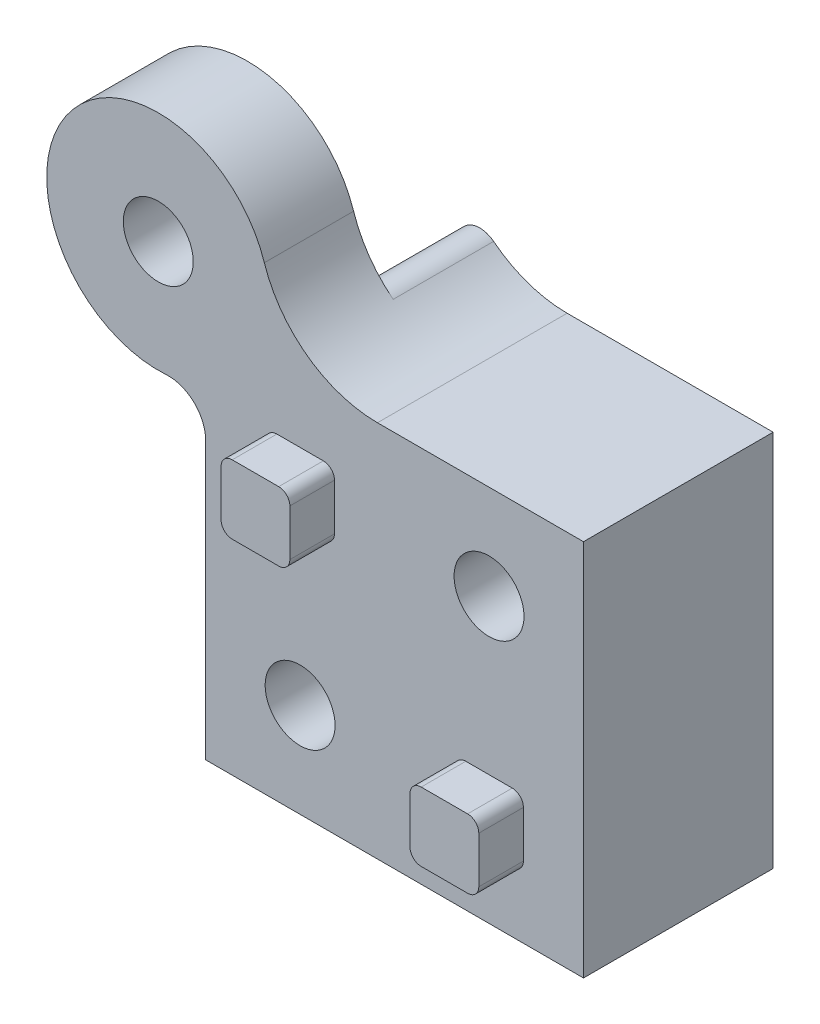
ISO-10303-21;
HEADER;
FILE_DESCRIPTION(('STEP AP214'),'2;1');
FILE_NAME('part.step','',(''),(''),'','','');
FILE_SCHEMA(('AUTOMOTIVE_DESIGN { 1 0 10303 214 1 1 1 1 }'));
ENDSEC;
DATA;
#1=APPLICATION_CONTEXT('core data for automotive mechanical design processes');
#2=APPLICATION_PROTOCOL_DEFINITION('international standard','automotive_design',2000,#1);
#3=PRODUCT_CONTEXT('',#1,'mechanical');
#4=PRODUCT('Part','Part','',(#3));
#5=PRODUCT_RELATED_PRODUCT_CATEGORY('part','',(#4));
#6=PRODUCT_DEFINITION_FORMATION('','',#4);
#7=PRODUCT_DEFINITION_CONTEXT('part definition',#1,'design');
#8=PRODUCT_DEFINITION('design','',#6,#7);
#9=PRODUCT_DEFINITION_SHAPE('','',#8);
#10=(LENGTH_UNIT() NAMED_UNIT(*) SI_UNIT(.MILLI.,.METRE.));
#11=(NAMED_UNIT(*) PLANE_ANGLE_UNIT() SI_UNIT($,.RADIAN.));
#12=(NAMED_UNIT(*) SI_UNIT($,.STERADIAN.) SOLID_ANGLE_UNIT());
#13=UNCERTAINTY_MEASURE_WITH_UNIT(LENGTH_MEASURE(1.E-05),#10,'distance_accuracy_value','');
#14=(GEOMETRIC_REPRESENTATION_CONTEXT(3) GLOBAL_UNCERTAINTY_ASSIGNED_CONTEXT((#13)) GLOBAL_UNIT_ASSIGNED_CONTEXT((#10,
#11,#12)) REPRESENTATION_CONTEXT('',''));
#15=CARTESIAN_POINT('',(0.,0.,0.));
#16=DIRECTION('',(0.,0.,1.));
#17=DIRECTION('',(1.,0.,0.));
#18=AXIS2_PLACEMENT_3D('',#15,#16,#17);
#19=CARTESIAN_POINT('',(0.,0.,-6.));
#20=DIRECTION('',(0.,0.,-1.));
#21=DIRECTION('',(-1.,0.,0.));
#22=AXIS2_PLACEMENT_3D('',#19,#20,#21);
#23=PLANE('',#22);
#24=CARTESIAN_POINT('',(66.6819805153394,193.68198051534,-6.));
#25=DIRECTION('',(0.,0.,-1.));
#26=DIRECTION('',(-1.,0.,0.));
#27=AXIS2_PLACEMENT_3D('',#24,#25,#26);
#28=CIRCLE('',#27,2.34999999999999);
#29=CARTESIAN_POINT('',(64.3319805153394,193.68198051534,-6.));
#30=VERTEX_POINT('',#29);
#31=EDGE_CURVE('E275',#30,#30,#28,.T.);
#32=ORIENTED_EDGE('',*,*,#31,.F.);
#33=EDGE_LOOP('',(#32));
#34=FACE_BOUND('',#33,.T.);
#35=CARTESIAN_POINT('',(66.6819805153394,193.68198051534,-6.));
#36=DIRECTION('',(0.,0.,1.));
#37=DIRECTION('',(1.,0.,0.));
#38=AXIS2_PLACEMENT_3D('',#35,#36,#37);
#39=CIRCLE('',#38,7.75);
#40=CARTESIAN_POINT('',(68.1617269345518,186.074559760916,-6.));
#41=VERTEX_POINT('',#40);
#42=CARTESIAN_POINT('',(74.1068195322732,191.460659833264,-6.));
#43=VERTEX_POINT('',#42);
#44=EDGE_CURVE('E245',#41,#43,#39,.T.);
#45=ORIENTED_EDGE('',*,*,#44,.F.);
#46=CARTESIAN_POINT('',(67.3639610306788,183.70526248902,-6.));
#47=DIRECTION('',(0.,0.,-1.));
#48=DIRECTION('',(-1.,0.,0.));
#49=AXIS2_PLACEMENT_3D('',#46,#47,#48);
#50=CIRCLE('',#49,2.5);
#51=CARTESIAN_POINT('',(67.193465901844,186.1994419956,-6.));
#52=VERTEX_POINT('',#51);
#53=EDGE_CURVE('E340',#41,#52,#50,.F.);
#54=ORIENTED_EDGE('',*,*,#53,.T.);
#55=CARTESIAN_POINT('',(66.6819805153394,193.68198051534,-6.));
#56=DIRECTION('',(0.,0.,-1.));
#57=DIRECTION('',(-1.,0.,0.));
#58=AXIS2_PLACEMENT_3D('',#55,#56,#57);
#59=CIRCLE('',#58,7.50000000000001);
#60=CARTESIAN_POINT('',(73.8104474944771,196.013280265982,-6.));
#61=VERTEX_POINT('',#60);
#62=EDGE_CURVE('E273',#52,#61,#59,.T.);
#63=ORIENTED_EDGE('',*,*,#62,.T.);
#64=CARTESIAN_POINT('',(81.4141456055572,198.5,-6.));
#65=DIRECTION('',(0.,0.,-1.));
#66=DIRECTION('',(-1.,0.,0.));
#67=AXIS2_PLACEMENT_3D('',#64,#65,#66);
#68=CIRCLE('',#67,8.);
#69=CARTESIAN_POINT('',(76.4707683785229,192.210085724651,-6.));
#70=VERTEX_POINT('',#69);
#71=EDGE_CURVE('E324',#61,#70,#68,.F.);
#72=ORIENTED_EDGE('',*,*,#71,.T.);
#73=CARTESIAN_POINT('',(75.5438851484539,191.030726798023,-6.));
#74=DIRECTION('',(0.,0.,-1.));
#75=DIRECTION('',(-1.,0.,0.));
#76=AXIS2_PLACEMENT_3D('',#73,#74,#75);
#77=CIRCLE('',#76,1.5);
#78=EDGE_CURVE('E350',#70,#43,#77,.F.);
#79=ORIENTED_EDGE('',*,*,#78,.T.);
#80=EDGE_LOOP('',(#45,#54,#63,#72,#79));
#81=FACE_BOUND('',#80,.T.);
#82=ADVANCED_FACE('F37',(#34,#81),#23,.T.);
#83=CARTESIAN_POINT('',(0.,0.,0.));
#84=DIRECTION('',(0.,0.,-1.));
#85=DIRECTION('',(-1.,0.,0.));
#86=AXIS2_PLACEMENT_3D('',#83,#84,#85);
#87=PLANE('',#86);
#88=CARTESIAN_POINT('',(88.9139610306788,184.15,0.));
#89=DIRECTION('',(0.,0.,-1.));
#90=DIRECTION('',(-1.,0.,0.));
#91=AXIS2_PLACEMENT_3D('',#88,#89,#90);
#92=CIRCLE('',#91,2.35);
#93=CARTESIAN_POINT('',(86.5639610306788,184.15,0.));
#94=VERTEX_POINT('',#93);
#95=EDGE_CURVE('E248',#94,#94,#92,.T.);
#96=ORIENTED_EDGE('',*,*,#95,.T.);
#97=EDGE_LOOP('',(#96));
#98=FACE_BOUND('',#97,.T.);
#99=CARTESIAN_POINT('',(76.2139610306788,171.45,0.));
#100=DIRECTION('',(0.,0.,-1.));
#101=DIRECTION('',(-1.,0.,0.));
#102=AXIS2_PLACEMENT_3D('',#99,#100,#101);
#103=CIRCLE('',#102,2.35);
#104=CARTESIAN_POINT('',(73.8639610306788,171.45,0.));
#105=VERTEX_POINT('',#104);
#106=EDGE_CURVE('E799',#105,#105,#103,.T.);
#107=ORIENTED_EDGE('',*,*,#106,.T.);
#108=EDGE_LOOP('',(#107));
#109=FACE_BOUND('',#108,.T.);
#110=CARTESIAN_POINT('',(66.6819805153394,193.68198051534,0.));
#111=DIRECTION('',(0.,0.,-1.));
#112=DIRECTION('',(-1.,0.,0.));
#113=AXIS2_PLACEMENT_3D('',#110,#111,#112);
#114=CIRCLE('',#113,2.34999999999999);
#115=CARTESIAN_POINT('',(64.3319805153394,193.68198051534,0.));
#116=VERTEX_POINT('',#115);
#117=EDGE_CURVE('E276',#116,#116,#114,.T.);
#118=ORIENTED_EDGE('',*,*,#117,.T.);
#119=EDGE_LOOP('',(#118));
#120=FACE_BOUND('',#119,.T.);
#121=CARTESIAN_POINT('',(66.6819805153394,193.68198051534,0.));
#122=DIRECTION('',(0.,0.,-1.));
#123=DIRECTION('',(-1.,0.,0.));
#124=AXIS2_PLACEMENT_3D('',#121,#122,#123);
#125=CIRCLE('',#124,7.50000000000001);
#126=CARTESIAN_POINT('',(67.193465901844,186.1994419956,0.));
#127=VERTEX_POINT('',#126);
#128=CARTESIAN_POINT('',(73.8104474944771,196.013280265982,0.));
#129=VERTEX_POINT('',#128);
#130=EDGE_CURVE('E262',#127,#129,#125,.T.);
#131=ORIENTED_EDGE('',*,*,#130,.F.);
#132=CARTESIAN_POINT('',(67.3639610306788,183.70526248902,0.));
#133=DIRECTION('',(0.,0.,-1.));
#134=DIRECTION('',(-1.,0.,0.));
#135=AXIS2_PLACEMENT_3D('',#132,#133,#134);
#136=CIRCLE('',#135,2.5);
#137=CARTESIAN_POINT('',(69.8639610306788,183.70526248902,0.));
#138=VERTEX_POINT('',#137);
#139=EDGE_CURVE('E332',#127,#138,#136,.T.);
#140=ORIENTED_EDGE('',*,*,#139,.T.);
#141=DIRECTION('',(0.,-1.,0.));
#142=VECTOR('',#141,1.);
#143=CARTESIAN_POINT('',(69.8639610306788,0.,0.));
#144=LINE('',#143,#142);
#145=CARTESIAN_POINT('',(69.8639610306788,165.1,0.));
#146=VERTEX_POINT('',#145);
#147=EDGE_CURVE('E287',#138,#146,#144,.T.);
#148=ORIENTED_EDGE('',*,*,#147,.T.);
#149=DIRECTION('',(1.,0.,0.));
#150=VECTOR('',#149,1.);
#151=CARTESIAN_POINT('',(0.,165.1,0.));
#152=LINE('',#151,#150);
#153=CARTESIAN_POINT('',(95.2639610306788,165.1,0.));
#154=VERTEX_POINT('',#153);
#155=EDGE_CURVE('E284',#146,#154,#152,.T.);
#156=ORIENTED_EDGE('',*,*,#155,.T.);
#157=DIRECTION('',(0.,1.,0.));
#158=VECTOR('',#157,1.);
#159=CARTESIAN_POINT('',(95.2639610306788,0.,0.));
#160=LINE('',#159,#158);
#161=CARTESIAN_POINT('',(95.2639610306788,190.5,0.));
#162=VERTEX_POINT('',#161);
#163=EDGE_CURVE('E282',#154,#162,#160,.T.);
#164=ORIENTED_EDGE('',*,*,#163,.T.);
#165=DIRECTION('',(-1.,0.,0.));
#166=VECTOR('',#165,1.);
#167=CARTESIAN_POINT('',(0.,190.5,0.));
#168=LINE('',#167,#166);
#169=CARTESIAN_POINT('',(81.4141456055572,190.5,0.));
#170=VERTEX_POINT('',#169);
#171=EDGE_CURVE('E228',#162,#170,#168,.T.);
#172=ORIENTED_EDGE('',*,*,#171,.T.);
#173=CARTESIAN_POINT('',(81.4141456055572,198.5,0.));
#174=DIRECTION('',(0.,0.,-1.));
#175=DIRECTION('',(-1.,0.,0.));
#176=AXIS2_PLACEMENT_3D('',#173,#174,#175);
#177=CIRCLE('',#176,8.);
#178=EDGE_CURVE('E321',#170,#129,#177,.T.);
#179=ORIENTED_EDGE('',*,*,#178,.T.);
#180=EDGE_LOOP('',(#131,#140,#148,#156,#164,#172,#179));
#181=FACE_BOUND('',#180,.T.);
#182=DIRECTION('',(0.,1.,0.));
#183=VECTOR('',#182,1.);
#184=CARTESIAN_POINT('',(78.5253610306788,181.8386,0.));
#185=LINE('',#184,#183);
#186=CARTESIAN_POINT('',(78.5253610306788,182.5886,0.));
#187=VERTEX_POINT('',#186);
#188=CARTESIAN_POINT('',(78.5253610306788,185.7114,0.));
#189=VERTEX_POINT('',#188);
#190=EDGE_CURVE('E232',#187,#189,#185,.T.);
#191=ORIENTED_EDGE('',*,*,#190,.F.);
#192=CARTESIAN_POINT('',(77.7753610306788,182.5886,0.));
#193=DIRECTION('',(0.,0.,-1.));
#194=DIRECTION('',(-1.,0.,0.));
#195=AXIS2_PLACEMENT_3D('',#192,#193,#194);
#196=CIRCLE('',#195,0.75);
#197=CARTESIAN_POINT('',(77.7753610306788,181.8386,0.));
#198=VERTEX_POINT('',#197);
#199=EDGE_CURVE('E415',#187,#198,#196,.T.);
#200=ORIENTED_EDGE('',*,*,#199,.T.);
#201=DIRECTION('',(1.,0.,0.));
#202=VECTOR('',#201,1.);
#203=CARTESIAN_POINT('',(73.9025610306788,181.8386,0.));
#204=LINE('',#203,#202);
#205=CARTESIAN_POINT('',(74.6525610306788,181.8386,0.));
#206=VERTEX_POINT('',#205);
#207=EDGE_CURVE('E298',#206,#198,#204,.T.);
#208=ORIENTED_EDGE('',*,*,#207,.F.);
#209=CARTESIAN_POINT('',(74.6525610306788,182.5886,0.));
#210=DIRECTION('',(0.,0.,-1.));
#211=DIRECTION('',(-1.,0.,0.));
#212=AXIS2_PLACEMENT_3D('',#209,#210,#211);
#213=CIRCLE('',#212,0.75);
#214=CARTESIAN_POINT('',(73.9025610306788,182.5886,0.));
#215=VERTEX_POINT('',#214);
#216=EDGE_CURVE('E417',#206,#215,#213,.T.);
#217=ORIENTED_EDGE('',*,*,#216,.T.);
#218=DIRECTION('',(0.,-1.,0.));
#219=VECTOR('',#218,1.);
#220=CARTESIAN_POINT('',(73.9025610306788,186.4614,0.));
#221=LINE('',#220,#219);
#222=CARTESIAN_POINT('',(73.9025610306788,185.7114,0.));
#223=VERTEX_POINT('',#222);
#224=EDGE_CURVE('E312',#223,#215,#221,.T.);
#225=ORIENTED_EDGE('',*,*,#224,.F.);
#226=CARTESIAN_POINT('',(74.6525610306788,185.7114,0.));
#227=DIRECTION('',(0.,0.,-1.));
#228=DIRECTION('',(-1.,0.,0.));
#229=AXIS2_PLACEMENT_3D('',#226,#227,#228);
#230=CIRCLE('',#229,0.75);
#231=CARTESIAN_POINT('',(74.6525610306788,186.4614,0.));
#232=VERTEX_POINT('',#231);
#233=EDGE_CURVE('E11',#223,#232,#230,.T.);
#234=ORIENTED_EDGE('',*,*,#233,.T.);
#235=DIRECTION('',(-1.,0.,0.));
#236=VECTOR('',#235,1.);
#237=CARTESIAN_POINT('',(78.5253610306788,186.4614,0.));
#238=LINE('',#237,#236);
#239=CARTESIAN_POINT('',(77.7753610306788,186.4614,0.));
#240=VERTEX_POINT('',#239);
#241=EDGE_CURVE('E310',#240,#232,#238,.T.);
#242=ORIENTED_EDGE('',*,*,#241,.F.);
#243=CARTESIAN_POINT('',(77.7753610306788,185.7114,0.));
#244=DIRECTION('',(0.,0.,-1.));
#245=DIRECTION('',(-1.,0.,0.));
#246=AXIS2_PLACEMENT_3D('',#243,#244,#245);
#247=CIRCLE('',#246,0.75);
#248=EDGE_CURVE('E45',#240,#189,#247,.T.);
#249=ORIENTED_EDGE('',*,*,#248,.T.);
#250=EDGE_LOOP('',(#191,#200,#208,#217,#225,#234,#242,#249));
#251=FACE_BOUND('',#250,.T.);
#252=DIRECTION('',(-1.,0.,0.));
#253=VECTOR('',#252,1.);
#254=CARTESIAN_POINT('',(91.2253610306788,173.7614,0.));
#255=LINE('',#254,#253);
#256=CARTESIAN_POINT('',(90.4753610306788,173.7614,0.));
#257=VERTEX_POINT('',#256);
#258=CARTESIAN_POINT('',(87.3525610306788,173.7614,0.));
#259=VERTEX_POINT('',#258);
#260=EDGE_CURVE('E244',#257,#259,#255,.T.);
#261=ORIENTED_EDGE('',*,*,#260,.F.);
#262=CARTESIAN_POINT('',(90.4753610306788,173.0114,0.));
#263=DIRECTION('',(0.,0.,-1.));
#264=DIRECTION('',(-1.,0.,0.));
#265=AXIS2_PLACEMENT_3D('',#262,#263,#264);
#266=CIRCLE('',#265,0.75);
#267=CARTESIAN_POINT('',(91.2253610306788,173.0114,0.));
#268=VERTEX_POINT('',#267);
#269=EDGE_CURVE('E411',#257,#268,#266,.T.);
#270=ORIENTED_EDGE('',*,*,#269,.T.);
#271=DIRECTION('',(0.,1.,0.));
#272=VECTOR('',#271,1.);
#273=CARTESIAN_POINT('',(91.2253610306788,169.1386,0.));
#274=LINE('',#273,#272);
#275=CARTESIAN_POINT('',(91.2253610306788,169.8886,0.));
#276=VERTEX_POINT('',#275);
#277=EDGE_CURVE('E253',#276,#268,#274,.T.);
#278=ORIENTED_EDGE('',*,*,#277,.F.);
#279=CARTESIAN_POINT('',(90.4753610306788,169.8886,0.));
#280=DIRECTION('',(0.,0.,-1.));
#281=DIRECTION('',(-1.,0.,0.));
#282=AXIS2_PLACEMENT_3D('',#279,#280,#281);
#283=CIRCLE('',#282,0.75);
#284=CARTESIAN_POINT('',(90.4753610306788,169.1386,0.));
#285=VERTEX_POINT('',#284);
#286=EDGE_CURVE('E409',#276,#285,#283,.T.);
#287=ORIENTED_EDGE('',*,*,#286,.T.);
#288=DIRECTION('',(1.,0.,0.));
#289=VECTOR('',#288,1.);
#290=CARTESIAN_POINT('',(86.6025610306788,169.1386,0.));
#291=LINE('',#290,#289);
#292=CARTESIAN_POINT('',(87.3525610306788,169.1386,0.));
#293=VERTEX_POINT('',#292);
#294=EDGE_CURVE('E268',#293,#285,#291,.T.);
#295=ORIENTED_EDGE('',*,*,#294,.F.);
#296=CARTESIAN_POINT('',(87.3525610306788,169.8886,0.));
#297=DIRECTION('',(0.,0.,-1.));
#298=DIRECTION('',(-1.,0.,0.));
#299=AXIS2_PLACEMENT_3D('',#296,#297,#298);
#300=CIRCLE('',#299,0.75);
#301=CARTESIAN_POINT('',(86.6025610306788,169.8886,0.));
#302=VERTEX_POINT('',#301);
#303=EDGE_CURVE('E407',#293,#302,#300,.T.);
#304=ORIENTED_EDGE('',*,*,#303,.T.);
#305=DIRECTION('',(0.,-1.,0.));
#306=VECTOR('',#305,1.);
#307=CARTESIAN_POINT('',(86.6025610306788,173.7614,0.));
#308=LINE('',#307,#306);
#309=CARTESIAN_POINT('',(86.6025610306788,173.0114,0.));
#310=VERTEX_POINT('',#309);
#311=EDGE_CURVE('E265',#310,#302,#308,.T.);
#312=ORIENTED_EDGE('',*,*,#311,.F.);
#313=CARTESIAN_POINT('',(87.3525610306788,173.0114,0.));
#314=DIRECTION('',(0.,0.,-1.));
#315=DIRECTION('',(-1.,0.,0.));
#316=AXIS2_PLACEMENT_3D('',#313,#314,#315);
#317=CIRCLE('',#316,0.75);
#318=EDGE_CURVE('E413',#310,#259,#317,.T.);
#319=ORIENTED_EDGE('',*,*,#318,.T.);
#320=EDGE_LOOP('',(#261,#270,#278,#287,#295,#304,#312,#319));
#321=FACE_BOUND('',#320,.T.);
#322=ADVANCED_FACE('F419',(#98,#109,#120,#181,#251,#321),#87,.F.);
#323=CARTESIAN_POINT('',(78.5253610306788,181.8386,3.));
#324=DIRECTION('',(-1.,0.,0.));
#325=DIRECTION('',(0.,0.,1.));
#326=AXIS2_PLACEMENT_3D('',#323,#324,#325);
#327=PLANE('',#326);
#328=DIRECTION('',(0.,1.,0.));
#329=VECTOR('',#328,1.);
#330=CARTESIAN_POINT('',(78.5253610306788,181.8386,3.));
#331=LINE('',#330,#329);
#332=CARTESIAN_POINT('',(78.5253610306788,182.5886,3.));
#333=VERTEX_POINT('',#332);
#334=CARTESIAN_POINT('',(78.5253610306788,185.7114,3.));
#335=VERTEX_POINT('',#334);
#336=EDGE_CURVE('E294',#333,#335,#331,.T.);
#337=ORIENTED_EDGE('',*,*,#336,.F.);
#338=DIRECTION('',(0.,0.,-1.));
#339=VECTOR('',#338,1.);
#340=CARTESIAN_POINT('',(78.5253610306788,182.5886,3.));
#341=LINE('',#340,#339);
#342=EDGE_CURVE('E382',#333,#187,#341,.T.);
#343=ORIENTED_EDGE('',*,*,#342,.T.);
#344=ORIENTED_EDGE('',*,*,#190,.T.);
#345=DIRECTION('',(0.,0.,-1.));
#346=VECTOR('',#345,1.);
#347=CARTESIAN_POINT('',(78.5253610306788,185.7114,3.));
#348=LINE('',#347,#346);
#349=EDGE_CURVE('E380',#189,#335,#348,.F.);
#350=ORIENTED_EDGE('',*,*,#349,.T.);
#351=EDGE_LOOP('',(#337,#343,#344,#350));
#352=FACE_BOUND('',#351,.T.);
#353=ADVANCED_FACE('F423',(#352),#327,.F.);
#354=CARTESIAN_POINT('',(78.5253610306788,186.4614,3.));
#355=DIRECTION('',(0.,-1.,0.));
#356=DIRECTION('',(0.,0.,-1.));
#357=AXIS2_PLACEMENT_3D('',#354,#355,#356);
#358=PLANE('',#357);
#359=DIRECTION('',(-1.,0.,0.));
#360=VECTOR('',#359,1.);
#361=CARTESIAN_POINT('',(78.5253610306788,186.4614,3.));
#362=LINE('',#361,#360);
#363=CARTESIAN_POINT('',(77.7753610306788,186.4614,3.));
#364=VERTEX_POINT('',#363);
#365=CARTESIAN_POINT('',(74.6525610306788,186.4614,3.));
#366=VERTEX_POINT('',#365);
#367=EDGE_CURVE('E297',#364,#366,#362,.T.);
#368=ORIENTED_EDGE('',*,*,#367,.F.);
#369=DIRECTION('',(0.,0.,-1.));
#370=VECTOR('',#369,1.);
#371=CARTESIAN_POINT('',(77.7753610306788,186.4614,3.));
#372=LINE('',#371,#370);
#373=EDGE_CURVE('E405',#364,#240,#372,.T.);
#374=ORIENTED_EDGE('',*,*,#373,.T.);
#375=ORIENTED_EDGE('',*,*,#241,.T.);
#376=DIRECTION('',(0.,0.,-1.));
#377=VECTOR('',#376,1.);
#378=CARTESIAN_POINT('',(74.6525610306788,186.4614,3.));
#379=LINE('',#378,#377);
#380=EDGE_CURVE('E403',#232,#366,#379,.F.);
#381=ORIENTED_EDGE('',*,*,#380,.T.);
#382=EDGE_LOOP('',(#368,#374,#375,#381));
#383=FACE_BOUND('',#382,.T.);
#384=ADVANCED_FACE('F432',(#383),#358,.F.);
#385=CARTESIAN_POINT('',(73.9025610306788,186.4614,3.));
#386=DIRECTION('',(1.,0.,0.));
#387=DIRECTION('',(0.,0.,-1.));
#388=AXIS2_PLACEMENT_3D('',#385,#386,#387);
#389=PLANE('',#388);
#390=ORIENTED_EDGE('',*,*,#224,.T.);
#391=DIRECTION('',(0.,0.,-1.));
#392=VECTOR('',#391,1.);
#393=CARTESIAN_POINT('',(73.9025610306788,182.5886,3.));
#394=LINE('',#393,#392);
#395=CARTESIAN_POINT('',(73.9025610306788,182.5886,3.));
#396=VERTEX_POINT('',#395);
#397=EDGE_CURVE('E401',#215,#396,#394,.F.);
#398=ORIENTED_EDGE('',*,*,#397,.T.);
#399=DIRECTION('',(0.,-1.,0.));
#400=VECTOR('',#399,1.);
#401=CARTESIAN_POINT('',(73.9025610306788,186.4614,3.));
#402=LINE('',#401,#400);
#403=CARTESIAN_POINT('',(73.9025610306788,185.7114,3.));
#404=VERTEX_POINT('',#403);
#405=EDGE_CURVE('E301',#404,#396,#402,.T.);
#406=ORIENTED_EDGE('',*,*,#405,.F.);
#407=DIRECTION('',(0.,0.,-1.));
#408=VECTOR('',#407,1.);
#409=CARTESIAN_POINT('',(73.9025610306788,185.7114,3.));
#410=LINE('',#409,#408);
#411=EDGE_CURVE('E398',#404,#223,#410,.T.);
#412=ORIENTED_EDGE('',*,*,#411,.T.);
#413=EDGE_LOOP('',(#390,#398,#406,#412));
#414=FACE_BOUND('',#413,.T.);
#415=ADVANCED_FACE('F439',(#414),#389,.F.);
#416=CARTESIAN_POINT('',(73.9025610306788,181.8386,3.));
#417=DIRECTION('',(0.,1.,0.));
#418=DIRECTION('',(0.,0.,1.));
#419=AXIS2_PLACEMENT_3D('',#416,#417,#418);
#420=PLANE('',#419);
#421=ORIENTED_EDGE('',*,*,#207,.T.);
#422=DIRECTION('',(0.,0.,-1.));
#423=VECTOR('',#422,1.);
#424=CARTESIAN_POINT('',(77.7753610306788,181.8386,3.));
#425=LINE('',#424,#423);
#426=CARTESIAN_POINT('',(77.7753610306788,181.8386,3.));
#427=VERTEX_POINT('',#426);
#428=EDGE_CURVE('E388',#198,#427,#425,.F.);
#429=ORIENTED_EDGE('',*,*,#428,.T.);
#430=DIRECTION('',(1.,0.,0.));
#431=VECTOR('',#430,1.);
#432=CARTESIAN_POINT('',(73.9025610306788,181.8386,3.));
#433=LINE('',#432,#431);
#434=CARTESIAN_POINT('',(74.6525610306788,181.8386,3.));
#435=VERTEX_POINT('',#434);
#436=EDGE_CURVE('E304',#435,#427,#433,.T.);
#437=ORIENTED_EDGE('',*,*,#436,.F.);
#438=DIRECTION('',(0.,0.,-1.));
#439=VECTOR('',#438,1.);
#440=CARTESIAN_POINT('',(74.6525610306788,181.8386,3.));
#441=LINE('',#440,#439);
#442=EDGE_CURVE('E385',#435,#206,#441,.T.);
#443=ORIENTED_EDGE('',*,*,#442,.T.);
#444=EDGE_LOOP('',(#421,#429,#437,#443));
#445=FACE_BOUND('',#444,.T.);
#446=ADVANCED_FACE('F447',(#445),#420,.F.);
#447=CARTESIAN_POINT('',(0.,0.,3.));
#448=DIRECTION('',(0.,0.,1.));
#449=DIRECTION('',(1.,0.,0.));
#450=AXIS2_PLACEMENT_3D('',#447,#448,#449);
#451=PLANE('',#450);
#452=ORIENTED_EDGE('',*,*,#436,.T.);
#453=CARTESIAN_POINT('',(77.7753610306788,182.5886,3.));
#454=DIRECTION('',(0.,0.,1.));
#455=DIRECTION('',(1.,0.,0.));
#456=AXIS2_PLACEMENT_3D('',#453,#454,#455);
#457=CIRCLE('',#456,0.75);
#458=EDGE_CURVE('E396',#427,#333,#457,.T.);
#459=ORIENTED_EDGE('',*,*,#458,.T.);
#460=ORIENTED_EDGE('',*,*,#336,.T.);
#461=CARTESIAN_POINT('',(77.7753610306788,185.7114,3.));
#462=DIRECTION('',(0.,0.,1.));
#463=DIRECTION('',(1.,0.,0.));
#464=AXIS2_PLACEMENT_3D('',#461,#462,#463);
#465=CIRCLE('',#464,0.75);
#466=EDGE_CURVE('E392',#335,#364,#465,.T.);
#467=ORIENTED_EDGE('',*,*,#466,.T.);
#468=ORIENTED_EDGE('',*,*,#367,.T.);
#469=CARTESIAN_POINT('',(74.6525610306788,185.7114,3.));
#470=DIRECTION('',(0.,0.,1.));
#471=DIRECTION('',(1.,0.,0.));
#472=AXIS2_PLACEMENT_3D('',#469,#470,#471);
#473=CIRCLE('',#472,0.75);
#474=EDGE_CURVE('E390',#366,#404,#473,.T.);
#475=ORIENTED_EDGE('',*,*,#474,.T.);
#476=ORIENTED_EDGE('',*,*,#405,.T.);
#477=CARTESIAN_POINT('',(74.6525610306788,182.5886,3.));
#478=DIRECTION('',(0.,0.,1.));
#479=DIRECTION('',(1.,0.,0.));
#480=AXIS2_PLACEMENT_3D('',#477,#478,#479);
#481=CIRCLE('',#480,0.75);
#482=EDGE_CURVE('E394',#396,#435,#481,.T.);
#483=ORIENTED_EDGE('',*,*,#482,.T.);
#484=EDGE_LOOP('',(#452,#459,#460,#467,#468,#475,#476,#483));
#485=FACE_BOUND('',#484,.T.);
#486=ADVANCED_FACE('F429',(#485),#451,.T.);
#487=CARTESIAN_POINT('',(66.6819805153394,193.68198051534,-6.));
#488=DIRECTION('',(0.,0.,1.));
#489=DIRECTION('',(1.,0.,0.));
#490=AXIS2_PLACEMENT_3D('',#487,#488,#489);
#491=CYLINDRICAL_SURFACE('',#490,7.50000000000001);
#492=ORIENTED_EDGE('',*,*,#62,.F.);
#493=DIRECTION('',(0.,0.,1.));
#494=VECTOR('',#493,1.);
#495=CARTESIAN_POINT('',(67.193465901844,186.1994419956,-6.));
#496=LINE('',#495,#494);
#497=EDGE_CURVE('E327',#52,#127,#496,.T.);
#498=ORIENTED_EDGE('',*,*,#497,.T.);
#499=ORIENTED_EDGE('',*,*,#130,.T.);
#500=DIRECTION('',(0.,0.,1.));
#501=VECTOR('',#500,1.);
#502=CARTESIAN_POINT('',(73.8104474944771,196.013280265982,-6.));
#503=LINE('',#502,#501);
#504=EDGE_CURVE('E318',#129,#61,#503,.F.);
#505=ORIENTED_EDGE('',*,*,#504,.T.);
#506=EDGE_LOOP('',(#492,#498,#499,#505));
#507=FACE_BOUND('',#506,.T.);
#508=ADVANCED_FACE('F495',(#507),#491,.T.);
#509=CARTESIAN_POINT('',(0.,190.5,-6.));
#510=DIRECTION('',(0.,1.,0.));
#511=DIRECTION('',(0.,0.,1.));
#512=AXIS2_PLACEMENT_3D('',#509,#510,#511);
#513=PLANE('',#512);
#514=DIRECTION('',(1.,0.,0.));
#515=VECTOR('',#514,1.);
#516=CARTESIAN_POINT('',(73.7486275278907,190.5,-12.75));
#517=LINE('',#516,#515);
#518=CARTESIAN_POINT('',(81.4141456055572,190.5,-12.75));
#519=VERTEX_POINT('',#518);
#520=CARTESIAN_POINT('',(95.2639610306788,190.5,-12.75));
#521=VERTEX_POINT('',#520);
#522=EDGE_CURVE('E209',#519,#521,#517,.T.);
#523=ORIENTED_EDGE('',*,*,#522,.F.);
#524=DIRECTION('',(0.,0.,1.));
#525=VECTOR('',#524,1.);
#526=CARTESIAN_POINT('',(81.4141456055572,190.5,-6.));
#527=LINE('',#526,#525);
#528=EDGE_CURVE('E307',#519,#170,#527,.T.);
#529=ORIENTED_EDGE('',*,*,#528,.T.);
#530=ORIENTED_EDGE('',*,*,#171,.F.);
#531=DIRECTION('',(0.,0.,1.));
#532=VECTOR('',#531,1.);
#533=CARTESIAN_POINT('',(95.2639610306788,190.5,-6.));
#534=LINE('',#533,#532);
#535=EDGE_CURVE('E225',#521,#162,#534,.T.);
#536=ORIENTED_EDGE('',*,*,#535,.F.);
#537=EDGE_LOOP('',(#523,#529,#530,#536));
#538=FACE_BOUND('',#537,.T.);
#539=ADVANCED_FACE('F226',(#538),#513,.T.);
#540=CARTESIAN_POINT('',(95.2639610306788,0.,-6.));
#541=DIRECTION('',(1.,0.,0.));
#542=DIRECTION('',(0.,0.,-1.));
#543=AXIS2_PLACEMENT_3D('',#540,#541,#542);
#544=PLANE('',#543);
#545=ORIENTED_EDGE('',*,*,#163,.F.);
#546=DIRECTION('',(0.,0.,1.));
#547=VECTOR('',#546,1.);
#548=CARTESIAN_POINT('',(95.2639610306788,165.1,-6.));
#549=LINE('',#548,#547);
#550=CARTESIAN_POINT('',(95.2639610306788,165.1,-12.75));
#551=VERTEX_POINT('',#550);
#552=EDGE_CURVE('E233',#551,#154,#549,.T.);
#553=ORIENTED_EDGE('',*,*,#552,.F.);
#554=DIRECTION('',(0.,-1.,0.));
#555=VECTOR('',#554,1.);
#556=CARTESIAN_POINT('',(95.2639610306788,190.5,-12.75));
#557=LINE('',#556,#555);
#558=EDGE_CURVE('E215',#521,#551,#557,.T.);
#559=ORIENTED_EDGE('',*,*,#558,.F.);
#560=ORIENTED_EDGE('',*,*,#535,.T.);
#561=EDGE_LOOP('',(#545,#553,#559,#560));
#562=FACE_BOUND('',#561,.T.);
#563=ADVANCED_FACE('F235',(#562),#544,.T.);
#564=CARTESIAN_POINT('',(0.,165.1,-6.));
#565=DIRECTION('',(0.,-1.,0.));
#566=DIRECTION('',(0.,0.,-1.));
#567=AXIS2_PLACEMENT_3D('',#564,#565,#566);
#568=PLANE('',#567);
#569=ORIENTED_EDGE('',*,*,#155,.F.);
#570=DIRECTION('',(0.,0.,1.));
#571=VECTOR('',#570,1.);
#572=CARTESIAN_POINT('',(69.8639610306788,165.1,-6.));
#573=LINE('',#572,#571);
#574=CARTESIAN_POINT('',(69.8639610306788,165.1,-12.75));
#575=VERTEX_POINT('',#574);
#576=EDGE_CURVE('E279',#575,#146,#573,.T.);
#577=ORIENTED_EDGE('',*,*,#576,.F.);
#578=DIRECTION('',(-1.,0.,0.));
#579=VECTOR('',#578,1.);
#580=CARTESIAN_POINT('',(95.2639610306788,165.1,-12.75));
#581=LINE('',#580,#579);
#582=EDGE_CURVE('E236',#551,#575,#581,.T.);
#583=ORIENTED_EDGE('',*,*,#582,.F.);
#584=ORIENTED_EDGE('',*,*,#552,.T.);
#585=EDGE_LOOP('',(#569,#577,#583,#584));
#586=FACE_BOUND('',#585,.T.);
#587=ADVANCED_FACE('F486',(#586),#568,.T.);
#588=CARTESIAN_POINT('',(69.8639610306788,0.,-6.));
#589=DIRECTION('',(-1.,0.,0.));
#590=DIRECTION('',(0.,0.,1.));
#591=AXIS2_PLACEMENT_3D('',#588,#589,#590);
#592=PLANE('',#591);
#593=ORIENTED_EDGE('',*,*,#147,.F.);
#594=DIRECTION('',(0.,0.,1.));
#595=VECTOR('',#594,1.);
#596=CARTESIAN_POINT('',(69.8639610306788,183.70526248902,-6.));
#597=LINE('',#596,#595);
#598=CARTESIAN_POINT('',(69.8639610306788,183.70526248902,-12.75));
#599=VERTEX_POINT('',#598);
#600=EDGE_CURVE('E330',#138,#599,#597,.F.);
#601=ORIENTED_EDGE('',*,*,#600,.T.);
#602=DIRECTION('',(0.,1.,0.));
#603=VECTOR('',#602,1.);
#604=CARTESIAN_POINT('',(69.8639610306788,165.1,-12.75));
#605=LINE('',#604,#603);
#606=EDGE_CURVE('E238',#575,#599,#605,.T.);
#607=ORIENTED_EDGE('',*,*,#606,.F.);
#608=ORIENTED_EDGE('',*,*,#576,.T.);
#609=EDGE_LOOP('',(#593,#601,#607,#608));
#610=FACE_BOUND('',#609,.T.);
#611=ADVANCED_FACE('F482',(#610),#592,.T.);
#612=CARTESIAN_POINT('',(66.6819805153394,193.68198051534,-6.));
#613=DIRECTION('',(0.,0.,1.));
#614=DIRECTION('',(1.,0.,0.));
#615=AXIS2_PLACEMENT_3D('',#612,#613,#614);
#616=CYLINDRICAL_SURFACE('',#615,2.34999999999999);
#617=ORIENTED_EDGE('',*,*,#31,.T.);
#618=EDGE_LOOP('',(#617));
#619=FACE_BOUND('',#618,.T.);
#620=ORIENTED_EDGE('',*,*,#117,.F.);
#621=EDGE_LOOP('',(#620));
#622=FACE_BOUND('',#621,.T.);
#623=ADVANCED_FACE('F479',(#619,#622),#616,.F.);
#624=CARTESIAN_POINT('',(91.2253610306788,173.7614,3.));
#625=DIRECTION('',(0.,-1.,0.));
#626=DIRECTION('',(0.,0.,-1.));
#627=AXIS2_PLACEMENT_3D('',#624,#625,#626);
#628=PLANE('',#627);
#629=DIRECTION('',(-1.,0.,0.));
#630=VECTOR('',#629,1.);
#631=CARTESIAN_POINT('',(91.2253610306788,173.7614,3.));
#632=LINE('',#631,#630);
#633=CARTESIAN_POINT('',(90.4753610306788,173.7614,3.));
#634=VERTEX_POINT('',#633);
#635=CARTESIAN_POINT('',(87.3525610306788,173.7614,3.));
#636=VERTEX_POINT('',#635);
#637=EDGE_CURVE('E249',#634,#636,#632,.T.);
#638=ORIENTED_EDGE('',*,*,#637,.F.);
#639=DIRECTION('',(0.,0.,-1.));
#640=VECTOR('',#639,1.);
#641=CARTESIAN_POINT('',(90.4753610306788,173.7614,3.));
#642=LINE('',#641,#640);
#643=EDGE_CURVE('E377',#634,#257,#642,.T.);
#644=ORIENTED_EDGE('',*,*,#643,.T.);
#645=ORIENTED_EDGE('',*,*,#260,.T.);
#646=DIRECTION('',(0.,0.,-1.));
#647=VECTOR('',#646,1.);
#648=CARTESIAN_POINT('',(87.3525610306788,173.7614,3.));
#649=LINE('',#648,#647);
#650=EDGE_CURVE('E375',#259,#636,#649,.F.);
#651=ORIENTED_EDGE('',*,*,#650,.T.);
#652=EDGE_LOOP('',(#638,#644,#645,#651));
#653=FACE_BOUND('',#652,.T.);
#654=ADVANCED_FACE('F476',(#653),#628,.F.);
#655=CARTESIAN_POINT('',(86.6025610306788,173.7614,3.));
#656=DIRECTION('',(1.,0.,0.));
#657=DIRECTION('',(0.,0.,-1.));
#658=AXIS2_PLACEMENT_3D('',#655,#656,#657);
#659=PLANE('',#658);
#660=ORIENTED_EDGE('',*,*,#311,.T.);
#661=DIRECTION('',(0.,0.,-1.));
#662=VECTOR('',#661,1.);
#663=CARTESIAN_POINT('',(86.6025610306788,169.8886,3.));
#664=LINE('',#663,#662);
#665=CARTESIAN_POINT('',(86.6025610306788,169.8886,3.));
#666=VERTEX_POINT('',#665);
#667=EDGE_CURVE('E360',#302,#666,#664,.F.);
#668=ORIENTED_EDGE('',*,*,#667,.T.);
#669=DIRECTION('',(0.,-1.,0.));
#670=VECTOR('',#669,1.);
#671=CARTESIAN_POINT('',(86.6025610306788,173.7614,3.));
#672=LINE('',#671,#670);
#673=CARTESIAN_POINT('',(86.6025610306788,173.0114,3.));
#674=VERTEX_POINT('',#673);
#675=EDGE_CURVE('E252',#674,#666,#672,.T.);
#676=ORIENTED_EDGE('',*,*,#675,.F.);
#677=DIRECTION('',(0.,0.,-1.));
#678=VECTOR('',#677,1.);
#679=CARTESIAN_POINT('',(86.6025610306788,173.0114,3.));
#680=LINE('',#679,#678);
#681=EDGE_CURVE('E357',#674,#310,#680,.T.);
#682=ORIENTED_EDGE('',*,*,#681,.T.);
#683=EDGE_LOOP('',(#660,#668,#676,#682));
#684=FACE_BOUND('',#683,.T.);
#685=ADVANCED_FACE('F549',(#684),#659,.F.);
#686=CARTESIAN_POINT('',(86.6025610306788,169.1386,3.));
#687=DIRECTION('',(0.,1.,0.));
#688=DIRECTION('',(0.,0.,1.));
#689=AXIS2_PLACEMENT_3D('',#686,#687,#688);
#690=PLANE('',#689);
#691=DIRECTION('',(1.,0.,0.));
#692=VECTOR('',#691,1.);
#693=CARTESIAN_POINT('',(86.6025610306788,169.1386,3.));
#694=LINE('',#693,#692);
#695=CARTESIAN_POINT('',(87.3525610306788,169.1386,3.));
#696=VERTEX_POINT('',#695);
#697=CARTESIAN_POINT('',(90.4753610306788,169.1386,3.));
#698=VERTEX_POINT('',#697);
#699=EDGE_CURVE('E256',#696,#698,#694,.T.);
#700=ORIENTED_EDGE('',*,*,#699,.F.);
#701=DIRECTION('',(0.,0.,-1.));
#702=VECTOR('',#701,1.);
#703=CARTESIAN_POINT('',(87.3525610306788,169.1386,3.));
#704=LINE('',#703,#702);
#705=EDGE_CURVE('E354',#696,#293,#704,.T.);
#706=ORIENTED_EDGE('',*,*,#705,.T.);
#707=ORIENTED_EDGE('',*,*,#294,.T.);
#708=DIRECTION('',(0.,0.,-1.));
#709=VECTOR('',#708,1.);
#710=CARTESIAN_POINT('',(90.4753610306788,169.1386,3.));
#711=LINE('',#710,#709);
#712=EDGE_CURVE('E352',#285,#698,#711,.F.);
#713=ORIENTED_EDGE('',*,*,#712,.T.);
#714=EDGE_LOOP('',(#700,#706,#707,#713));
#715=FACE_BOUND('',#714,.T.);
#716=ADVANCED_FACE('F556',(#715),#690,.F.);
#717=CARTESIAN_POINT('',(91.2253610306788,169.1386,3.));
#718=DIRECTION('',(-1.,0.,0.));
#719=DIRECTION('',(0.,0.,1.));
#720=AXIS2_PLACEMENT_3D('',#717,#718,#719);
#721=PLANE('',#720);
#722=DIRECTION('',(0.,1.,0.));
#723=VECTOR('',#722,1.);
#724=CARTESIAN_POINT('',(91.2253610306788,169.1386,3.));
#725=LINE('',#724,#723);
#726=CARTESIAN_POINT('',(91.2253610306788,169.8886,3.));
#727=VERTEX_POINT('',#726);
#728=CARTESIAN_POINT('',(91.2253610306788,173.0114,3.));
#729=VERTEX_POINT('',#728);
#730=EDGE_CURVE('E259',#727,#729,#725,.T.);
#731=ORIENTED_EDGE('',*,*,#730,.F.);
#732=DIRECTION('',(0.,0.,-1.));
#733=VECTOR('',#732,1.);
#734=CARTESIAN_POINT('',(91.2253610306788,169.8886,3.));
#735=LINE('',#734,#733);
#736=EDGE_CURVE('E372',#727,#276,#735,.T.);
#737=ORIENTED_EDGE('',*,*,#736,.T.);
#738=ORIENTED_EDGE('',*,*,#277,.T.);
#739=DIRECTION('',(0.,0.,-1.));
#740=VECTOR('',#739,1.);
#741=CARTESIAN_POINT('',(91.2253610306788,173.0114,3.));
#742=LINE('',#741,#740);
#743=EDGE_CURVE('E370',#268,#729,#742,.F.);
#744=ORIENTED_EDGE('',*,*,#743,.T.);
#745=EDGE_LOOP('',(#731,#737,#738,#744));
#746=FACE_BOUND('',#745,.T.);
#747=ADVANCED_FACE('F561',(#746),#721,.F.);
#748=CARTESIAN_POINT('',(0.,0.,3.));
#749=DIRECTION('',(0.,0.,1.));
#750=DIRECTION('',(1.,0.,0.));
#751=AXIS2_PLACEMENT_3D('',#748,#749,#750);
#752=PLANE('',#751);
#753=ORIENTED_EDGE('',*,*,#675,.T.);
#754=CARTESIAN_POINT('',(87.3525610306788,169.8886,3.));
#755=DIRECTION('',(0.,0.,1.));
#756=DIRECTION('',(1.,0.,0.));
#757=AXIS2_PLACEMENT_3D('',#754,#755,#756);
#758=CIRCLE('',#757,0.75);
#759=EDGE_CURVE('E368',#666,#696,#758,.T.);
#760=ORIENTED_EDGE('',*,*,#759,.T.);
#761=ORIENTED_EDGE('',*,*,#699,.T.);
#762=CARTESIAN_POINT('',(90.4753610306788,169.8886,3.));
#763=DIRECTION('',(0.,0.,1.));
#764=DIRECTION('',(1.,0.,0.));
#765=AXIS2_PLACEMENT_3D('',#762,#763,#764);
#766=CIRCLE('',#765,0.75);
#767=EDGE_CURVE('E366',#698,#727,#766,.T.);
#768=ORIENTED_EDGE('',*,*,#767,.T.);
#769=ORIENTED_EDGE('',*,*,#730,.T.);
#770=CARTESIAN_POINT('',(90.4753610306788,173.0114,3.));
#771=DIRECTION('',(0.,0.,1.));
#772=DIRECTION('',(1.,0.,0.));
#773=AXIS2_PLACEMENT_3D('',#770,#771,#772);
#774=CIRCLE('',#773,0.75);
#775=EDGE_CURVE('E364',#729,#634,#774,.T.);
#776=ORIENTED_EDGE('',*,*,#775,.T.);
#777=ORIENTED_EDGE('',*,*,#637,.T.);
#778=CARTESIAN_POINT('',(87.3525610306788,173.0114,3.));
#779=DIRECTION('',(0.,0.,1.));
#780=DIRECTION('',(1.,0.,0.));
#781=AXIS2_PLACEMENT_3D('',#778,#779,#780);
#782=CIRCLE('',#781,0.75);
#783=EDGE_CURVE('E362',#636,#674,#782,.T.);
#784=ORIENTED_EDGE('',*,*,#783,.T.);
#785=EDGE_LOOP('',(#753,#760,#761,#768,#769,#776,#777,#784));
#786=FACE_BOUND('',#785,.T.);
#787=ADVANCED_FACE('F539',(#786),#752,.T.);
#788=CARTESIAN_POINT('',(66.6819805153394,193.68198051534,-12.75));
#789=DIRECTION('',(0.,0.,1.));
#790=DIRECTION('',(1.,0.,0.));
#791=AXIS2_PLACEMENT_3D('',#788,#789,#790);
#792=CYLINDRICAL_SURFACE('',#791,7.75);
#793=ORIENTED_EDGE('',*,*,#44,.T.);
#794=DIRECTION('',(0.,0.,1.));
#795=VECTOR('',#794,1.);
#796=CARTESIAN_POINT('',(74.1068195322732,191.460659833264,-12.75));
#797=LINE('',#796,#795);
#798=CARTESIAN_POINT('',(74.1068195322732,191.460659833264,-12.75));
#799=VERTEX_POINT('',#798);
#800=EDGE_CURVE('E342',#43,#799,#797,.F.);
#801=ORIENTED_EDGE('',*,*,#800,.T.);
#802=CARTESIAN_POINT('',(66.6819805153394,193.68198051534,-12.75));
#803=DIRECTION('',(0.,0.,1.));
#804=DIRECTION('',(1.,0.,0.));
#805=AXIS2_PLACEMENT_3D('',#802,#803,#804);
#806=CIRCLE('',#805,7.75);
#807=CARTESIAN_POINT('',(68.1617269345518,186.074559760916,-12.75));
#808=VERTEX_POINT('',#807);
#809=EDGE_CURVE('E222',#808,#799,#806,.T.);
#810=ORIENTED_EDGE('',*,*,#809,.F.);
#811=DIRECTION('',(0.,0.,1.));
#812=VECTOR('',#811,1.);
#813=CARTESIAN_POINT('',(68.1617269345518,186.074559760916,-12.75));
#814=LINE('',#813,#812);
#815=EDGE_CURVE('E337',#808,#41,#814,.T.);
#816=ORIENTED_EDGE('',*,*,#815,.T.);
#817=EDGE_LOOP('',(#793,#801,#810,#816));
#818=FACE_BOUND('',#817,.T.);
#819=ADVANCED_FACE('F569',(#818),#792,.F.);
#820=CARTESIAN_POINT('',(66.6819805153394,193.68198051534,-12.75));
#821=DIRECTION('',(0.,0.,1.));
#822=DIRECTION('',(1.,0.,0.));
#823=AXIS2_PLACEMENT_3D('',#820,#821,#822);
#824=PLANE('',#823);
#825=CARTESIAN_POINT('',(88.9139610306788,184.15,-12.75));
#826=DIRECTION('',(0.,0.,1.));
#827=DIRECTION('',(1.,0.,0.));
#828=AXIS2_PLACEMENT_3D('',#825,#826,#827);
#829=CIRCLE('',#828,2.35);
#830=CARTESIAN_POINT('',(91.2639610306788,184.15,-12.75));
#831=VERTEX_POINT('',#830);
#832=EDGE_CURVE('E796',#831,#831,#829,.T.);
#833=ORIENTED_EDGE('',*,*,#832,.T.);
#834=EDGE_LOOP('',(#833));
#835=FACE_BOUND('',#834,.T.);
#836=CARTESIAN_POINT('',(76.2139610306788,171.45,-12.75));
#837=DIRECTION('',(0.,0.,1.));
#838=DIRECTION('',(1.,0.,0.));
#839=AXIS2_PLACEMENT_3D('',#836,#837,#838);
#840=CIRCLE('',#839,2.35);
#841=CARTESIAN_POINT('',(78.5639610306788,171.45,-12.75));
#842=VERTEX_POINT('',#841);
#843=EDGE_CURVE('E820',#842,#842,#840,.T.);
#844=ORIENTED_EDGE('',*,*,#843,.T.);
#845=EDGE_LOOP('',(#844));
#846=FACE_BOUND('',#845,.T.);
#847=ORIENTED_EDGE('',*,*,#809,.T.);
#848=CARTESIAN_POINT('',(75.5438851484539,191.030726798023,-12.75));
#849=DIRECTION('',(0.,0.,1.));
#850=DIRECTION('',(1.,0.,0.));
#851=AXIS2_PLACEMENT_3D('',#848,#849,#850);
#852=CIRCLE('',#851,1.5);
#853=CARTESIAN_POINT('',(76.4707683785229,192.210085724651,-12.75));
#854=VERTEX_POINT('',#853);
#855=EDGE_CURVE('E345',#799,#854,#852,.F.);
#856=ORIENTED_EDGE('',*,*,#855,.T.);
#857=CARTESIAN_POINT('',(81.4141456055572,198.5,-12.75));
#858=DIRECTION('',(0.,0.,1.));
#859=DIRECTION('',(1.,0.,0.));
#860=AXIS2_PLACEMENT_3D('',#857,#858,#859);
#861=CIRCLE('',#860,8.);
#862=EDGE_CURVE('E218',#854,#519,#861,.T.);
#863=ORIENTED_EDGE('',*,*,#862,.T.);
#864=ORIENTED_EDGE('',*,*,#522,.T.);
#865=ORIENTED_EDGE('',*,*,#558,.T.);
#866=ORIENTED_EDGE('',*,*,#582,.T.);
#867=ORIENTED_EDGE('',*,*,#606,.T.);
#868=CARTESIAN_POINT('',(67.3639610306788,183.70526248902,-12.75));
#869=DIRECTION('',(0.,0.,1.));
#870=DIRECTION('',(1.,0.,0.));
#871=AXIS2_PLACEMENT_3D('',#868,#869,#870);
#872=CIRCLE('',#871,2.5);
#873=EDGE_CURVE('E334',#599,#808,#872,.T.);
#874=ORIENTED_EDGE('',*,*,#873,.T.);
#875=EDGE_LOOP('',(#847,#856,#863,#864,#865,#866,#867,#874));
#876=FACE_BOUND('',#875,.T.);
#877=ADVANCED_FACE('F212',(#835,#846,#876),#824,.F.);
#878=CARTESIAN_POINT('',(76.2139610306788,171.45,-12.75));
#879=DIRECTION('',(0.,0.,1.));
#880=DIRECTION('',(1.,0.,0.));
#881=AXIS2_PLACEMENT_3D('',#878,#879,#880);
#882=CYLINDRICAL_SURFACE('',#881,2.35);
#883=ORIENTED_EDGE('',*,*,#843,.F.);
#884=EDGE_LOOP('',(#883));
#885=FACE_BOUND('',#884,.T.);
#886=ORIENTED_EDGE('',*,*,#106,.F.);
#887=EDGE_LOOP('',(#886));
#888=FACE_BOUND('',#887,.T.);
#889=ADVANCED_FACE('F622',(#885,#888),#882,.F.);
#890=CARTESIAN_POINT('',(88.9139610306788,184.15,-12.75));
#891=DIRECTION('',(0.,0.,1.));
#892=DIRECTION('',(1.,0.,0.));
#893=AXIS2_PLACEMENT_3D('',#890,#891,#892);
#894=CYLINDRICAL_SURFACE('',#893,2.35);
#895=ORIENTED_EDGE('',*,*,#832,.F.);
#896=EDGE_LOOP('',(#895));
#897=FACE_BOUND('',#896,.T.);
#898=ORIENTED_EDGE('',*,*,#95,.F.);
#899=EDGE_LOOP('',(#898));
#900=FACE_BOUND('',#899,.T.);
#901=ADVANCED_FACE('F513',(#897,#900),#894,.F.);
#902=CARTESIAN_POINT('',(81.4141456055572,198.5,-6.));
#903=DIRECTION('',(0.,0.,1.));
#904=DIRECTION('',(1.,0.,0.));
#905=AXIS2_PLACEMENT_3D('',#902,#903,#904);
#906=CYLINDRICAL_SURFACE('',#905,8.);
#907=ORIENTED_EDGE('',*,*,#862,.F.);
#908=DIRECTION('',(0.,0.,1.));
#909=VECTOR('',#908,1.);
#910=CARTESIAN_POINT('',(76.4707683785229,192.210085724651,-6.));
#911=LINE('',#910,#909);
#912=EDGE_CURVE('E347',#854,#70,#911,.T.);
#913=ORIENTED_EDGE('',*,*,#912,.T.);
#914=ORIENTED_EDGE('',*,*,#71,.F.);
#915=ORIENTED_EDGE('',*,*,#504,.F.);
#916=ORIENTED_EDGE('',*,*,#178,.F.);
#917=ORIENTED_EDGE('',*,*,#528,.F.);
#918=EDGE_LOOP('',(#907,#913,#914,#915,#916,#917));
#919=FACE_BOUND('',#918,.T.);
#920=ADVANCED_FACE('F509',(#919),#906,.F.);
#921=CARTESIAN_POINT('',(67.3639610306788,183.70526248902,-6.));
#922=DIRECTION('',(0.,0.,1.));
#923=DIRECTION('',(1.,0.,0.));
#924=AXIS2_PLACEMENT_3D('',#921,#922,#923);
#925=CYLINDRICAL_SURFACE('',#924,2.5);
#926=ORIENTED_EDGE('',*,*,#873,.F.);
#927=ORIENTED_EDGE('',*,*,#600,.F.);
#928=ORIENTED_EDGE('',*,*,#139,.F.);
#929=ORIENTED_EDGE('',*,*,#497,.F.);
#930=ORIENTED_EDGE('',*,*,#53,.F.);
#931=ORIENTED_EDGE('',*,*,#815,.F.);
#932=EDGE_LOOP('',(#926,#927,#928,#929,#930,#931));
#933=FACE_BOUND('',#932,.T.);
#934=ADVANCED_FACE('F512',(#933),#925,.F.);
#935=CARTESIAN_POINT('',(75.5438851484539,191.030726798023,-6.));
#936=DIRECTION('',(0.,0.,-1.));
#937=DIRECTION('',(-1.,0.,0.));
#938=AXIS2_PLACEMENT_3D('',#935,#936,#937);
#939=CYLINDRICAL_SURFACE('',#938,1.5);
#940=ORIENTED_EDGE('',*,*,#78,.F.);
#941=ORIENTED_EDGE('',*,*,#912,.F.);
#942=ORIENTED_EDGE('',*,*,#855,.F.);
#943=ORIENTED_EDGE('',*,*,#800,.F.);
#944=EDGE_LOOP('',(#940,#941,#942,#943));
#945=FACE_BOUND('',#944,.T.);
#946=ADVANCED_FACE('F517',(#945),#939,.T.);
#947=CARTESIAN_POINT('',(87.3525610306788,169.8886,3.));
#948=DIRECTION('',(0.,0.,-1.));
#949=DIRECTION('',(-1.,0.,0.));
#950=AXIS2_PLACEMENT_3D('',#947,#948,#949);
#951=CYLINDRICAL_SURFACE('',#950,0.75);
#952=ORIENTED_EDGE('',*,*,#759,.F.);
#953=ORIENTED_EDGE('',*,*,#667,.F.);
#954=ORIENTED_EDGE('',*,*,#303,.F.);
#955=ORIENTED_EDGE('',*,*,#705,.F.);
#956=EDGE_LOOP('',(#952,#953,#954,#955));
#957=FACE_BOUND('',#956,.T.);
#958=ADVANCED_FACE('F521',(#957),#951,.T.);
#959=CARTESIAN_POINT('',(90.4753610306788,169.8886,3.));
#960=DIRECTION('',(0.,0.,-1.));
#961=DIRECTION('',(-1.,0.,0.));
#962=AXIS2_PLACEMENT_3D('',#959,#960,#961);
#963=CYLINDRICAL_SURFACE('',#962,0.75);
#964=ORIENTED_EDGE('',*,*,#767,.F.);
#965=ORIENTED_EDGE('',*,*,#712,.F.);
#966=ORIENTED_EDGE('',*,*,#286,.F.);
#967=ORIENTED_EDGE('',*,*,#736,.F.);
#968=EDGE_LOOP('',(#964,#965,#966,#967));
#969=FACE_BOUND('',#968,.T.);
#970=ADVANCED_FACE('F525',(#969),#963,.T.);
#971=CARTESIAN_POINT('',(90.4753610306788,173.0114,3.));
#972=DIRECTION('',(0.,0.,-1.));
#973=DIRECTION('',(-1.,0.,0.));
#974=AXIS2_PLACEMENT_3D('',#971,#972,#973);
#975=CYLINDRICAL_SURFACE('',#974,0.75);
#976=ORIENTED_EDGE('',*,*,#775,.F.);
#977=ORIENTED_EDGE('',*,*,#743,.F.);
#978=ORIENTED_EDGE('',*,*,#269,.F.);
#979=ORIENTED_EDGE('',*,*,#643,.F.);
#980=EDGE_LOOP('',(#976,#977,#978,#979));
#981=FACE_BOUND('',#980,.T.);
#982=ADVANCED_FACE('F460',(#981),#975,.T.);
#983=CARTESIAN_POINT('',(87.3525610306788,173.0114,3.));
#984=DIRECTION('',(0.,0.,-1.));
#985=DIRECTION('',(-1.,0.,0.));
#986=AXIS2_PLACEMENT_3D('',#983,#984,#985);
#987=CYLINDRICAL_SURFACE('',#986,0.75);
#988=ORIENTED_EDGE('',*,*,#783,.F.);
#989=ORIENTED_EDGE('',*,*,#650,.F.);
#990=ORIENTED_EDGE('',*,*,#318,.F.);
#991=ORIENTED_EDGE('',*,*,#681,.F.);
#992=EDGE_LOOP('',(#988,#989,#990,#991));
#993=FACE_BOUND('',#992,.T.);
#994=ADVANCED_FACE('F453',(#993),#987,.T.);
#995=CARTESIAN_POINT('',(77.7753610306788,182.5886,3.));
#996=DIRECTION('',(0.,0.,-1.));
#997=DIRECTION('',(-1.,0.,0.));
#998=AXIS2_PLACEMENT_3D('',#995,#996,#997);
#999=CYLINDRICAL_SURFACE('',#998,0.75);
#1000=ORIENTED_EDGE('',*,*,#458,.F.);
#1001=ORIENTED_EDGE('',*,*,#428,.F.);
#1002=ORIENTED_EDGE('',*,*,#199,.F.);
#1003=ORIENTED_EDGE('',*,*,#342,.F.);
#1004=EDGE_LOOP('',(#1000,#1001,#1002,#1003));
#1005=FACE_BOUND('',#1004,.T.);
#1006=ADVANCED_FACE('F451',(#1005),#999,.T.);
#1007=CARTESIAN_POINT('',(74.6525610306788,182.5886,3.));
#1008=DIRECTION('',(0.,0.,-1.));
#1009=DIRECTION('',(-1.,0.,0.));
#1010=AXIS2_PLACEMENT_3D('',#1007,#1008,#1009);
#1011=CYLINDRICAL_SURFACE('',#1010,0.75);
#1012=ORIENTED_EDGE('',*,*,#482,.F.);
#1013=ORIENTED_EDGE('',*,*,#397,.F.);
#1014=ORIENTED_EDGE('',*,*,#216,.F.);
#1015=ORIENTED_EDGE('',*,*,#442,.F.);
#1016=EDGE_LOOP('',(#1012,#1013,#1014,#1015));
#1017=FACE_BOUND('',#1016,.T.);
#1018=ADVANCED_FACE('F442',(#1017),#1011,.T.);
#1019=CARTESIAN_POINT('',(77.7753610306788,185.7114,3.));
#1020=DIRECTION('',(0.,0.,-1.));
#1021=DIRECTION('',(-1.,0.,0.));
#1022=AXIS2_PLACEMENT_3D('',#1019,#1020,#1021);
#1023=CYLINDRICAL_SURFACE('',#1022,0.75);
#1024=ORIENTED_EDGE('',*,*,#466,.F.);
#1025=ORIENTED_EDGE('',*,*,#349,.F.);
#1026=ORIENTED_EDGE('',*,*,#248,.F.);
#1027=ORIENTED_EDGE('',*,*,#373,.F.);
#1028=EDGE_LOOP('',(#1024,#1025,#1026,#1027));
#1029=FACE_BOUND('',#1028,.T.);
#1030=ADVANCED_FACE('F426',(#1029),#1023,.T.);
#1031=CARTESIAN_POINT('',(74.6525610306788,185.7114,3.));
#1032=DIRECTION('',(0.,0.,-1.));
#1033=DIRECTION('',(-1.,0.,0.));
#1034=AXIS2_PLACEMENT_3D('',#1031,#1032,#1033);
#1035=CYLINDRICAL_SURFACE('',#1034,0.75);
#1036=ORIENTED_EDGE('',*,*,#474,.F.);
#1037=ORIENTED_EDGE('',*,*,#380,.F.);
#1038=ORIENTED_EDGE('',*,*,#233,.F.);
#1039=ORIENTED_EDGE('',*,*,#411,.F.);
#1040=EDGE_LOOP('',(#1036,#1037,#1038,#1039));
#1041=FACE_BOUND('',#1040,.T.);
#1042=ADVANCED_FACE('F39',(#1041),#1035,.T.);
#1043=CLOSED_SHELL('',(#82,#322,#353,#384,#415,#446,#486,#508,#539,#563,#587,#611,#623,#654,
#685,#716,#747,#787,#819,#877,#889,#901,#920,#934,#946,#958,#970,#982,#994,#1006,#1018,#1030,#1042));
#1044=MANIFOLD_SOLID_BREP('B2',#1043);
#1045=ADVANCED_BREP_SHAPE_REPRESENTATION('',(#18,#1044),#14);
#1046=SHAPE_DEFINITION_REPRESENTATION(#9,#1045);
ENDSEC;
END-ISO-10303-21;
